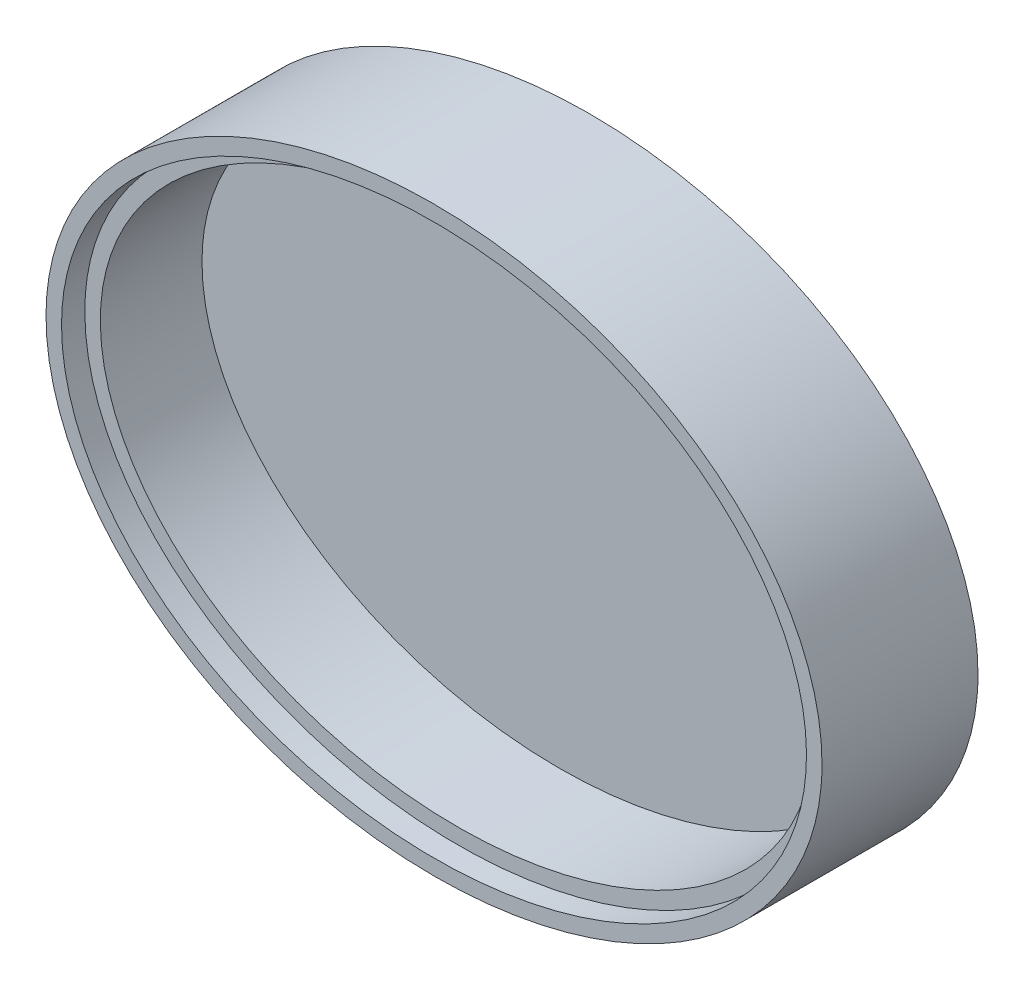
ISO-10303-21;
HEADER;
FILE_DESCRIPTION(('STEP AP214'),'2;1');
FILE_NAME('part.step','',(''),(''),'','','');
FILE_SCHEMA(('AUTOMOTIVE_DESIGN { 1 0 10303 214 1 1 1 1 }'));
ENDSEC;
DATA;
#1=APPLICATION_CONTEXT('core data for automotive mechanical design processes');
#2=APPLICATION_PROTOCOL_DEFINITION('international standard','automotive_design',2000,#1);
#3=PRODUCT_CONTEXT('',#1,'mechanical');
#4=PRODUCT('Part','Part','',(#3));
#5=PRODUCT_RELATED_PRODUCT_CATEGORY('part','',(#4));
#6=PRODUCT_DEFINITION_FORMATION('','',#4);
#7=PRODUCT_DEFINITION_CONTEXT('part definition',#1,'design');
#8=PRODUCT_DEFINITION('design','',#6,#7);
#9=PRODUCT_DEFINITION_SHAPE('','',#8);
#10=(LENGTH_UNIT() NAMED_UNIT(*) SI_UNIT(.MILLI.,.METRE.));
#11=(NAMED_UNIT(*) PLANE_ANGLE_UNIT() SI_UNIT($,.RADIAN.));
#12=(NAMED_UNIT(*) SI_UNIT($,.STERADIAN.) SOLID_ANGLE_UNIT());
#13=UNCERTAINTY_MEASURE_WITH_UNIT(LENGTH_MEASURE(1.E-05),#10,'distance_accuracy_value','');
#14=(GEOMETRIC_REPRESENTATION_CONTEXT(3) GLOBAL_UNCERTAINTY_ASSIGNED_CONTEXT((#13)) GLOBAL_UNIT_ASSIGNED_CONTEXT((#10,
#11,#12)) REPRESENTATION_CONTEXT('',''));
#15=CARTESIAN_POINT('',(0.,0.,0.));
#16=DIRECTION('',(0.,0.,1.));
#17=DIRECTION('',(1.,0.,0.));
#18=AXIS2_PLACEMENT_3D('',#15,#16,#17);
#19=CARTESIAN_POINT('',(0.,0.,20.1));
#20=DIRECTION('',(0.,0.,1.));
#21=DIRECTION('',(1.,0.,0.));
#22=AXIS2_PLACEMENT_3D('',#19,#20,#21);
#23=ELLIPSE('',#22,50.,37.5);
#24=DIRECTION('',(0.,0.,-1.));
#25=VECTOR('',#24,1.);
#26=SURFACE_OF_LINEAR_EXTRUSION('',#23,#25);
#27=CARTESIAN_POINT('',(50.,0.,20.1));
#28=VERTEX_POINT('',#27);
#29=EDGE_CURVE('E12',#28,#28,#23,.T.);
#30=ORIENTED_EDGE('',*,*,#29,.F.);
#31=EDGE_LOOP('',(#30));
#32=FACE_BOUND('',#31,.T.);
#33=CARTESIAN_POINT('',(0.,0.,0.));
#34=DIRECTION('',(0.,0.,1.));
#35=DIRECTION('',(1.,0.,0.));
#36=AXIS2_PLACEMENT_3D('',#33,#34,#35);
#37=ELLIPSE('',#36,50.,37.5);
#38=CARTESIAN_POINT('',(50.,0.,0.));
#39=VERTEX_POINT('',#38);
#40=EDGE_CURVE('E75',#39,#39,#37,.T.);
#41=ORIENTED_EDGE('',*,*,#40,.T.);
#42=EDGE_LOOP('',(#41));
#43=FACE_BOUND('',#42,.T.);
#44=ADVANCED_FACE('F61',(#32,#43),#26,.F.);
#45=CARTESIAN_POINT('',(0.,0.,20.1));
#46=DIRECTION('',(0.,0.,1.));
#47=DIRECTION('',(1.,0.,0.));
#48=AXIS2_PLACEMENT_3D('',#45,#46,#47);
#49=PLANE('',#48);
#50=CARTESIAN_POINT('',(0.,0.,20.1));
#51=DIRECTION('',(0.,0.,1.));
#52=DIRECTION('',(-1.,0.,0.));
#53=AXIS2_PLACEMENT_3D('',#50,#51,#52);
#54=ELLIPSE('',#53,48.,35.5);
#55=CARTESIAN_POINT('',(-48.,0.,20.1));
#56=VERTEX_POINT('',#55);
#57=EDGE_CURVE('E217',#56,#56,#54,.T.);
#58=ORIENTED_EDGE('',*,*,#57,.F.);
#59=EDGE_LOOP('',(#58));
#60=FACE_BOUND('',#59,.T.);
#61=ORIENTED_EDGE('',*,*,#29,.T.);
#62=EDGE_LOOP('',(#61));
#63=FACE_BOUND('',#62,.T.);
#64=ADVANCED_FACE('F106',(#60,#63),#49,.T.);
#65=CARTESIAN_POINT('',(0.,0.,0.));
#66=DIRECTION('',(0.,0.,1.));
#67=DIRECTION('',(1.,0.,0.));
#68=AXIS2_PLACEMENT_3D('',#65,#66,#67);
#69=PLANE('',#68);
#70=ORIENTED_EDGE('',*,*,#40,.F.);
#71=EDGE_LOOP('',(#70));
#72=FACE_BOUND('',#71,.T.);
#73=ADVANCED_FACE('F108',(#72),#69,.F.);
#74=CARTESIAN_POINT('',(0.,0.,17.1));
#75=DIRECTION('',(0.,0.,1.));
#76=DIRECTION('',(-1.,0.,0.));
#77=AXIS2_PLACEMENT_3D('',#74,#75,#76);
#78=ELLIPSE('',#77,48.,35.5);
#79=DIRECTION('',(0.,0.,1.));
#80=VECTOR('',#79,1.);
#81=SURFACE_OF_LINEAR_EXTRUSION('',#78,#80);
#82=CARTESIAN_POINT('',(-48.,0.,17.1));
#83=VERTEX_POINT('',#82);
#84=EDGE_CURVE('E212',#83,#83,#78,.T.);
#85=ORIENTED_EDGE('',*,*,#84,.F.);
#86=EDGE_LOOP('',(#85));
#87=FACE_BOUND('',#86,.T.);
#88=ORIENTED_EDGE('',*,*,#57,.T.);
#89=EDGE_LOOP('',(#88));
#90=FACE_BOUND('',#89,.T.);
#91=ADVANCED_FACE('F111',(#87,#90),#81,.F.);
#92=CARTESIAN_POINT('',(0.,0.,17.1));
#93=DIRECTION('',(0.,0.,1.));
#94=DIRECTION('',(1.,0.,0.));
#95=AXIS2_PLACEMENT_3D('',#92,#93,#94);
#96=PLANE('',#95);
#97=CARTESIAN_POINT('',(46.,0.,17.1));
#98=CARTESIAN_POINT('',(45.999990115339,0.720024415514175,17.1));
#99=CARTESIAN_POINT('',(45.9676969535407,1.44026365261996,17.1));
#100=CARTESIAN_POINT('',(45.8391276929752,2.87518913099918,17.1));
#101=CARTESIAN_POINT('',(45.7428234579524,3.58987279048201,17.1));
#102=CARTESIAN_POINT('',(45.4879122244435,5.00918065721287,17.1));
#103=CARTESIAN_POINT('',(45.3292081554156,5.71378741014139,17.1));
#104=CARTESIAN_POINT('',(44.9524690364869,7.10680925465893,17.1));
#105=CARTESIAN_POINT('',(44.7344400755839,7.79522600008666,17.1));
#106=CARTESIAN_POINT('',(44.24417204866,9.14794686513593,17.1));
#107=CARTESIAN_POINT('',(43.9722503818986,9.81236643773387,17.1));
#108=CARTESIAN_POINT('',(43.3775260535112,11.1179950674307,17.1));
#109=CARTESIAN_POINT('',(43.0547204716707,11.759202789809,17.1));
#110=CARTESIAN_POINT('',(42.3627558135586,13.0155297598765,17.1));
#111=CARTESIAN_POINT('',(41.993624657623,13.6306644254982,17.1));
#112=CARTESIAN_POINT('',(41.2132328496304,14.8333827189064,17.1));
#113=CARTESIAN_POINT('',(40.8019765824852,15.4209692049913,17.1));
#114=CARTESIAN_POINT('',(39.7631742044163,16.8049704902302,17.1));
#115=CARTESIAN_POINT('',(39.1165678192279,17.5871390855512,17.1));
#116=CARTESIAN_POINT('',(37.758375164116,19.0921456655243,17.1));
#117=CARTESIAN_POINT('',(37.0468018178889,19.8149953962224,17.1));
#118=CARTESIAN_POINT('',(35.5618162655722,21.2071484106292,17.1));
#119=CARTESIAN_POINT('',(34.7879284224296,21.8759424456422,17.1));
#120=CARTESIAN_POINT('',(33.1920420831159,23.1536360677172,17.1));
#121=CARTESIAN_POINT('',(32.3700348619913,23.7625247388162,17.1));
#122=CARTESIAN_POINT('',(31.1061644231233,24.6318370649833,17.1));
#123=CARTESIAN_POINT('',(30.6793839062989,24.9144755573382,17.1));
#124=CARTESIAN_POINT('',(29.8165722586804,25.4650187860401,17.1));
#125=CARTESIAN_POINT('',(29.3805435495056,25.7329273149751,17.1));
#126=CARTESIAN_POINT('',(28.0597462818835,26.5148005304729,17.1));
#127=CARTESIAN_POINT('',(27.1620454956099,27.0070641886344,17.1));
#128=CARTESIAN_POINT('',(25.1792208529042,28.0155690898059,17.1));
#129=CARTESIAN_POINT('',(24.0886549072573,28.521089582153,17.1));
#130=CARTESIAN_POINT('',(21.8766482680563,29.4555674732487,17.1));
#131=CARTESIAN_POINT('',(20.7552387468291,29.8845991154026,17.1));
#132=CARTESIAN_POINT('',(18.0723430835572,30.8119444379895,17.1));
#133=CARTESIAN_POINT('',(16.4997431705678,31.2783146298995,17.1));
#134=CARTESIAN_POINT('',(13.3202873972492,32.077319158505,17.1));
#135=CARTESIAN_POINT('',(11.7134119426401,32.4098747159201,17.1));
#136=CARTESIAN_POINT('',(8.47945428101142,32.9436877097692,17.1));
#137=CARTESIAN_POINT('',(6.85239010818363,33.1450547835589,17.1));
#138=CARTESIAN_POINT('',(3.58777179406265,33.4187295086884,17.1));
#139=CARTESIAN_POINT('',(1.95021937804701,33.4910578656458,17.1));
#140=CARTESIAN_POINT('',(-1.32547723173237,33.5073850578491,17.1));
#141=CARTESIAN_POINT('',(-2.9636214080981,33.4513874005873,17.1));
#142=CARTESIAN_POINT('',(-6.23055820978415,33.2105468886148,17.1));
#143=CARTESIAN_POINT('',(-7.8593503214109,33.0256970232507,17.1));
#144=CARTESIAN_POINT('',(-11.0794540520963,32.5281563248961,17.1));
#145=CARTESIAN_POINT('',(-12.670980330065,32.2168595978729,17.1));
#146=CARTESIAN_POINT('',(-15.8229563316285,31.4637865431486,17.1));
#147=CARTESIAN_POINT('',(-17.3834087754245,31.0220216906919,17.1));
#148=CARTESIAN_POINT('',(-20.2844188646607,30.0623613211243,17.1));
#149=CARTESIAN_POINT('',(-21.6297529069752,29.5589014421907,17.1));
#150=CARTESIAN_POINT('',(-24.2747020131478,28.4434395898801,17.1));
#151=CARTESIAN_POINT('',(-25.5743257218669,27.8314582740835,17.1));
#152=CARTESIAN_POINT('',(-27.9399890424851,26.5873386199161,17.1));
#153=CARTESIAN_POINT('',(-29.0135731467934,25.9695456596651,17.1));
#154=CARTESIAN_POINT('',(-31.1068845080929,24.6482513049911,17.1));
#155=CARTESIAN_POINT('',(-32.1266165949294,23.9447576156181,17.1));
#156=CARTESIAN_POINT('',(-33.9573011563569,22.5582108189922,17.1));
#157=CARTESIAN_POINT('',(-34.7771332924504,21.8868862134155,17.1));
#158=CARTESIAN_POINT('',(-36.3589682952707,20.4797176851427,17.1));
#159=CARTESIAN_POINT('',(-37.1210012521521,19.7439077694653,17.1));
#160=CARTESIAN_POINT('',(-38.4770823317484,18.3131915292161,17.1));
#161=CARTESIAN_POINT('',(-39.0798252208424,17.6265566682081,17.1));
#162=CARTESIAN_POINT('',(-39.9404729102131,16.5610265435434,17.1));
#163=CARTESIAN_POINT('',(-40.2202713089135,16.199684652988,17.1));
#164=CARTESIAN_POINT('',(-40.7643062722167,15.465349367683,17.1));
#165=CARTESIAN_POINT('',(-41.0285394819073,15.0923534873606,17.1));
#166=CARTESIAN_POINT('',(-41.7418501665301,14.0368179977532,17.1));
#167=CARTESIAN_POINT('',(-42.1726715930206,13.3417744019237,17.1));
#168=CARTESIAN_POINT('',(-42.9746995369692,11.917881845297,17.1));
#169=CARTESIAN_POINT('',(-43.3458917538005,11.1890248290213,17.1));
#170=CARTESIAN_POINT('',(-44.0222796571298,9.70091048902919,17.1));
#171=CARTESIAN_POINT('',(-44.3274683159366,8.94164993830386,17.1));
#172=CARTESIAN_POINT('',(-44.7310606591149,7.78412012124577,17.1));
#173=CARTESIAN_POINT('',(-44.8565693751974,7.39513104973345,17.1));
#174=CARTESIAN_POINT('',(-45.0888843448192,6.61162062533261,17.1));
#175=CARTESIAN_POINT('',(-45.1956923777981,6.21709980267348,17.1));
#176=CARTESIAN_POINT('',(-45.4170849194538,5.31263153988426,17.1));
#177=CARTESIAN_POINT('',(-45.5255350535559,4.80116970255663,17.1));
#178=CARTESIAN_POINT('',(-45.7097739395517,3.77238486490653,17.1));
#179=CARTESIAN_POINT('',(-45.7855618764405,3.25506171866001,17.1));
#180=CARTESIAN_POINT('',(-45.9036972269667,2.21660740863111,17.1));
#181=CARTESIAN_POINT('',(-45.9460451686752,1.69547630511362,17.1));
#182=CARTESIAN_POINT('',(-45.9968386432803,0.651886836175442,17.1));
#183=CARTESIAN_POINT('',(-46.0053051288865,0.12942949103661,17.1));
#184=CARTESIAN_POINT('',(-45.9883004982608,-0.914946483863848,17.1));
#185=CARTESIAN_POINT('',(-45.9628288377081,-1.43686510485073,17.1));
#186=CARTESIAN_POINT('',(-45.8782335776505,-2.4778630906691,17.1));
#187=CARTESIAN_POINT('',(-45.8191147538411,-2.9969428478797,17.1));
#188=CARTESIAN_POINT('',(-45.644266813479,-4.19113559699108,17.1));
#189=CARTESIAN_POINT('',(-45.5166461208896,-4.86453696067709,17.1));
#190=CARTESIAN_POINT('',(-45.206768714853,-6.19848402099751,17.1));
#191=CARTESIAN_POINT('',(-45.024517637475,-6.85903103629772,17.1));
#192=CARTESIAN_POINT('',(-44.6082441819838,-8.16372053899362,17.1));
#193=CARTESIAN_POINT('',(-44.3742107201653,-8.80785948137548,17.1));
#194=CARTESIAN_POINT('',(-43.8577990691227,-10.0764254471221,17.1));
#195=CARTESIAN_POINT('',(-43.575418170711,-10.7008513635278,17.1));
#196=CARTESIAN_POINT('',(-42.947084963491,-11.9655270068485,17.1));
#197=CARTESIAN_POINT('',(-42.5982756324822,-12.6043552133538,17.1));
#198=CARTESIAN_POINT('',(-41.8547875096157,-13.8546970850282,17.1));
#199=CARTESIAN_POINT('',(-41.4601057628685,-14.4662089870907,17.1));
#200=CARTESIAN_POINT('',(-40.6294047889637,-15.6602158787531,17.1));
#201=CARTESIAN_POINT('',(-40.1933937006159,-16.2427165470884,17.1));
#202=CARTESIAN_POINT('',(-39.2840700625004,-17.3779835703174,17.1));
#203=CARTESIAN_POINT('',(-38.8107497341165,-17.9307436839579,17.1));
#204=CARTESIAN_POINT('',(-37.947929819273,-18.8773706691614,17.1));
#205=CARTESIAN_POINT('',(-37.5654226594271,-19.2776469090383,17.1));
#206=CARTESIAN_POINT('',(-36.7827993300297,-20.0604221063859,17.1));
#207=CARTESIAN_POINT('',(-36.3826860253512,-20.4429239354357,17.1));
#208=CARTESIAN_POINT('',(-35.1585260127391,-21.5634312594158,17.1));
#209=CARTESIAN_POINT('',(-34.3101061715451,-22.2750405442364,17.1));
#210=CARTESIAN_POINT('',(-32.5604297020443,-23.6272055273565,17.1));
#211=CARTESIAN_POINT('',(-31.6592363566754,-24.2678437670444,17.1));
#212=CARTESIAN_POINT('',(-29.8117369786443,-25.4806164576257,17.1));
#213=CARTESIAN_POINT('',(-28.8654198587274,-26.0527339499204,17.1));
#214=CARTESIAN_POINT('',(-26.6178349735788,-27.3071565839778,17.1));
#215=CARTESIAN_POINT('',(-25.3022065108578,-27.9637990734609,17.1));
#216=CARTESIAN_POINT('',(-22.6197748273085,-29.1625198384624,17.1));
#217=CARTESIAN_POINT('',(-21.2529589080867,-29.7045694616108,17.1));
#218=CARTESIAN_POINT('',(-18.4820633388183,-30.6770084021456,17.1));
#219=CARTESIAN_POINT('',(-17.0780277542263,-31.1075237840213,17.1));
#220=CARTESIAN_POINT('',(-14.2415657035517,-31.8606486256633,17.1));
#221=CARTESIAN_POINT('',(-12.8091414893749,-32.1832666083042,17.1));
#222=CARTESIAN_POINT('',(-9.92530374165991,-32.7228363015313,17.1));
#223=CARTESIAN_POINT('',(-8.47389939559561,-32.939837324531,17.1));
#224=CARTESIAN_POINT('',(-5.55935053862219,-33.2699766459477,17.1));
#225=CARTESIAN_POINT('',(-4.09620583217974,-33.3831132108862,17.1));
#226=CARTESIAN_POINT('',(-1.16580563270898,-33.506337194503,17.1));
#227=CARTESIAN_POINT('',(0.301449258550584,-33.5164389827077,17.1));
#228=CARTESIAN_POINT('',(3.23305308127978,-33.4337049702699,17.1));
#229=CARTESIAN_POINT('',(4.69740203818764,-33.3408700747414,17.1));
#230=CARTESIAN_POINT('',(7.61612094288179,-33.0515601161527,17.1));
#231=CARTESIAN_POINT('',(9.07048913977001,-32.8550673168434,17.1));
#232=CARTESIAN_POINT('',(11.961236493436,-32.3569919008615,17.1));
#233=CARTESIAN_POINT('',(13.3976151972871,-32.0554066437339,17.1));
#234=CARTESIAN_POINT('',(16.2445347206341,-31.3447784967655,17.1));
#235=CARTESIAN_POINT('',(17.6550600770853,-30.9356734068076,17.1));
#236=CARTESIAN_POINT('',(20.4394734624621,-30.0072227528074,17.1));
#237=CARTESIAN_POINT('',(21.8133639752503,-29.487884684124,17.1));
#238=CARTESIAN_POINT('',(24.3946532740993,-28.3859583988257,17.1));
#239=CARTESIAN_POINT('',(25.6061040522932,-27.8128748800683,17.1));
#240=CARTESIAN_POINT('',(27.9780971296663,-26.5690871496972,17.1));
#241=CARTESIAN_POINT('',(29.138642231669,-25.8983883215023,17.1));
#242=CARTESIAN_POINT('',(31.2294159728165,-24.562819733653,17.1));
#243=CARTESIAN_POINT('',(32.1683906551255,-23.9116417883005,17.1));
#244=CARTESIAN_POINT('',(33.9897114430654,-22.5350848996556,17.1));
#245=CARTESIAN_POINT('',(34.8720935710529,-21.8097539346671,17.1));
#246=CARTESIAN_POINT('',(36.4485339966777,-20.3924031405022,17.1));
#247=CARTESIAN_POINT('',(37.1515261952683,-19.7103222132642,17.1));
#248=CARTESIAN_POINT('',(38.5006201859011,-18.2896931601504,17.1));
#249=CARTESIAN_POINT('',(39.1466309833765,-17.5510581136757,17.1));
#250=CARTESIAN_POINT('',(40.3003152043383,-16.1078673401824,17.1));
#251=CARTESIAN_POINT('',(40.8153506318164,-15.4092039191089,17.1));
#252=CARTESIAN_POINT('',(41.7854430014883,-13.9708845505371,17.1));
#253=CARTESIAN_POINT('',(42.2404771539251,-13.2312131779985,17.1));
#254=CARTESIAN_POINT('',(43.0819886013713,-11.7153354856601,17.1));
#255=CARTESIAN_POINT('',(43.4685931624879,-10.9392004584966,17.1));
#256=CARTESIAN_POINT('',(43.9919181393195,-9.75063721855407,17.1));
#257=CARTESIAN_POINT('',(44.1569034161954,-9.35046798727479,17.1));
#258=CARTESIAN_POINT('',(44.4672045567344,-8.54259789689242,17.1));
#259=CARTESIAN_POINT('',(44.6125236868167,-8.13489830134983,17.1));
#260=CARTESIAN_POINT('',(44.8485414517685,-7.41656922862468,17.1));
#261=CARTESIAN_POINT('',(44.9437674094153,-7.10741917112181,17.1));
#262=CARTESIAN_POINT('',(45.1224176278797,-6.48579612190264,17.1));
#263=CARTESIAN_POINT('',(45.2058440086753,-6.17332373796844,17.1));
#264=CARTESIAN_POINT('',(45.437889106707,-5.23183417155692,17.1));
#265=CARTESIAN_POINT('',(45.5684334113312,-4.59826045786406,17.1));
#266=CARTESIAN_POINT('',(45.7819034537495,-3.30653253413109,17.1));
#267=CARTESIAN_POINT('',(45.8635340763903,-2.64816292997793,17.1));
#268=CARTESIAN_POINT('',(45.9453279659479,-1.65716764627293,17.1));
#269=CARTESIAN_POINT('',(45.9658173106521,-1.32611779791166,17.1));
#270=CARTESIAN_POINT('',(45.9931569741325,-0.663393906325981,17.1));
#271=CARTESIAN_POINT('',(46.0000045539252,-0.331719751131501,17.1));
#272=CARTESIAN_POINT('',(46.,0.,17.1));
#273=B_SPLINE_CURVE_WITH_KNOTS('',3,(#97,#98,#99,#100,#101,#102,#103,#104,#105,#106,#107,#108,
#109,#110,#111,#112,#113,#114,#115,#116,#117,#118,#119,#120,#121,#122,#123,#124,#125,#126,#127,
#128,#129,#130,#131,#132,#133,#134,#135,#136,#137,#138,#139,#140,#141,#142,#143,#144,#145,#146,
#147,#148,#149,#150,#151,#152,#153,#154,#155,#156,#157,#158,#159,#160,#161,#162,#163,#164,#165,
#166,#167,#168,#169,#170,#171,#172,#173,#174,#175,#176,#177,#178,#179,#180,#181,#182,#183,#184,
#185,#186,#187,#188,#189,#190,#191,#192,#193,#194,#195,#196,#197,#198,#199,#200,#201,#202,#203,
#204,#205,#206,#207,#208,#209,#210,#211,#212,#213,#214,#215,#216,#217,#218,#219,#220,#221,#222,
#223,#224,#225,#226,#227,#228,#229,#230,#231,#232,#233,#234,#235,#236,#237,#238,#239,#240,#241,
#242,#243,#244,#245,#246,#247,#248,#249,#250,#251,#252,#253,#254,#255,#256,#257,#258,#259,#260,
#261,#262,#263,#264,#265,#266,#267,#268,#269,#270,#271,#272),.UNSPECIFIED.,.T.,.F.,(4,2,2,2,2,2,
2,2,2,2,2,2,2,2,2,2,2,2,2,2,2,2,2,2,2,2,2,2,2,2,2,2,2,2,2,2,2,2,2,2,2,2,2,2,2,2,2,2,2,2,2,2,2,2,
2,2,2,2,2,2,2,2,2,2,2,2,2,2,2,2,2,2,2,2,2,2,2,2,2,2,2,2,2,2,2,2,2,4),(0.,2.1597288923423,
4.32040772821799,6.48446114690481,8.64829253485918,10.7997397897789,12.9513105606744,
15.1015907560129,17.2516473501465,20.2917588640528,23.331266929267,26.3966974907636,
29.4626856048476,30.9980916581475,32.5331005144107,35.6023161000945,39.2053475681941,
42.8048625074875,47.7192873307651,52.6366011534083,57.5498001695428,62.4622107403564,
67.374487043493,72.2870306370047,77.1468220102746,82.0061860707926,86.3111550072651,
90.6153053500319,94.3275547271761,98.0394705950603,101.215155882077,104.389176400744,
107.127077877736,108.497732577858,109.868681635211,112.318986503946,114.769878144677,
117.221030614369,118.446848771095,119.672550223204,121.239984990301,122.80745886662,
124.374907989523,125.941387632653,127.50789240024,129.074174882078,131.12787193892,
133.181357194265,135.235282411609,137.289322760005,139.470790382399,141.652398602838,
143.833578097548,146.015213556095,147.675605858084,149.335728972892,152.65353150994,
155.967433912753,159.282154805073,163.687267221583,168.093479776561,172.494690150142,
176.895552787551,181.294358692404,185.693238011173,190.091503841184,194.489730997903,
198.88871095169,203.287801438107,207.689442417184,212.090784199807,216.107176279325,
220.123346941384,223.547975687531,226.970402496271,229.905983284842,232.846170144723,
235.447306621518,238.049428236656,240.646658350208,241.944778407094,243.242682589352,
244.212910970328,245.182964812615,247.121547307386,249.109419164452,250.104220056447,
251.099220663707),.UNSPECIFIED.);
#274=CARTESIAN_POINT('',(46.,0.,17.1));
#275=VERTEX_POINT('',#274);
#276=EDGE_CURVE('E64',#275,#275,#273,.T.);
#277=ORIENTED_EDGE('',*,*,#276,.F.);
#278=EDGE_LOOP('',(#277));
#279=FACE_BOUND('',#278,.T.);
#280=ORIENTED_EDGE('',*,*,#84,.T.);
#281=EDGE_LOOP('',(#280));
#282=FACE_BOUND('',#281,.T.);
#283=ADVANCED_FACE('F104',(#279,#282),#96,.T.);
#284=CARTESIAN_POINT('',(0.,0.,4.));
#285=DIRECTION('',(0.,0.,1.));
#286=DIRECTION('',(1.,0.,0.));
#287=AXIS2_PLACEMENT_3D('',#284,#285,#286);
#288=PLANE('',#287);
#289=CARTESIAN_POINT('',(-46.,0.,4.));
#290=CARTESIAN_POINT('',(-46.0000006467883,-0.479954722660342,4.));
#291=CARTESIAN_POINT('',(-45.9856670328346,-0.959899282770047,4.));
#292=CARTESIAN_POINT('',(-45.9284478329094,-1.91834687574689,4.));
#293=CARTESIAN_POINT('',(-45.8855467720532,-2.39684898604587,4.));
#294=CARTESIAN_POINT('',(-45.7715516631447,-3.35052953986645,4.));
#295=CARTESIAN_POINT('',(-45.700454498937,-3.82570761011545,4.));
#296=CARTESIAN_POINT('',(-45.5305296787989,-4.7719622918162,4.));
#297=CARTESIAN_POINT('',(-45.431651797274,-5.24302986641563,4.));
#298=CARTESIAN_POINT('',(-45.207054312938,-6.17866063370336,4.));
#299=CARTESIAN_POINT('',(-45.0813377682988,-6.64322456103833,4.));
#300=CARTESIAN_POINT('',(-44.804074172818,-7.56451641508421,4.));
#301=CARTESIAN_POINT('',(-44.6525283607939,-8.02124471644987,4.));
#302=CARTESIAN_POINT('',(-44.2442558395394,-9.14769723581948,4.));
#303=CARTESIAN_POINT('',(-43.9724024143176,-9.8119895819827,4.));
#304=CARTESIAN_POINT('',(-43.37787129037,-11.1172802195231,4.));
#305=CARTESIAN_POINT('',(-43.0551936053094,-11.7582785171633,4.));
#306=CARTESIAN_POINT('',(-42.3633598822285,-13.0144981474507,4.));
#307=CARTESIAN_POINT('',(-41.9942102309263,-13.6297230067284,4.));
#308=CARTESIAN_POINT('',(-41.2135981912669,-14.8328585766816,4.));
#309=CARTESIAN_POINT('',(-40.802126516464,-15.4207632514058,4.));
#310=CARTESIAN_POINT('',(-40.0634089334466,-16.40497078764,4.));
#311=CARTESIAN_POINT('',(-39.7454255692537,-16.8082752826699,4.));
#312=CARTESIAN_POINT('',(-39.0914505330545,-17.5998435174175,4.));
#313=CARTESIAN_POINT('',(-38.755462375185,-17.9881101668874,4.));
#314=CARTESIAN_POINT('',(-37.7221939627186,-19.1304740267664,4.));
#315=CARTESIAN_POINT('',(-36.9997220431923,-19.8619867376826,4.));
#316=CARTESIAN_POINT('',(-35.496711061608,-21.2650907526631,4.));
#317=CARTESIAN_POINT('',(-34.716068308825,-21.9365701232031,4.));
#318=CARTESIAN_POINT('',(-33.1065033557533,-23.2187056136901,4.));
#319=CARTESIAN_POINT('',(-32.277580180043,-23.8293605041085,4.));
#320=CARTESIAN_POINT('',(-30.2851833813543,-25.1916817150326,4.));
#321=CARTESIAN_POINT('',(-29.1051090644375,-25.9191289850137,4.));
#322=CARTESIAN_POINT('',(-26.6861997819331,-27.2688296417489,4.));
#323=CARTESIAN_POINT('',(-25.447344903225,-27.8910470491673,4.));
#324=CARTESIAN_POINT('',(-22.9230639460643,-29.0335959767781,4.));
#325=CARTESIAN_POINT('',(-21.6376186110286,-29.553884785832,4.));
#326=CARTESIAN_POINT('',(-19.031186389475,-30.4952206744786,4.));
#327=CARTESIAN_POINT('',(-17.7102025221879,-30.916276155114,4.));
#328=CARTESIAN_POINT('',(-15.0104281654146,-31.6704523555623,4.));
#329=CARTESIAN_POINT('',(-13.6310074536017,-32.0013099508537,4.));
#330=CARTESIAN_POINT('',(-10.8522096228388,-32.564126100929,4.));
#331=CARTESIAN_POINT('',(-9.45283223770196,-32.7960833352796,4.));
#332=CARTESIAN_POINT('',(-6.64097956604895,-33.1627242739075,4.));
#333=CARTESIAN_POINT('',(-5.22850031836199,-33.2973775198188,4.));
#334=CARTESIAN_POINT('',(-2.39762218949036,-33.4702164199296,4.));
#335=CARTESIAN_POINT('',(-0.979222876451217,-33.5083949088302,4.));
#336=CARTESIAN_POINT('',(2.15028936003574,-33.4864771782414,4.));
#337=CARTESIAN_POINT('',(3.86129380899522,-33.4044319687027,4.));
#338=CARTESIAN_POINT('',(7.27107557032004,-33.0993727492565,4.));
#339=CARTESIAN_POINT('',(8.96985010674585,-32.8763276959086,4.));
#340=CARTESIAN_POINT('',(12.3422823537543,-32.2870775517606,4.));
#341=CARTESIAN_POINT('',(14.0159432464359,-31.92089075996,4.));
#342=CARTESIAN_POINT('',(17.3240751003877,-31.0418565115656,4.));
#343=CARTESIAN_POINT('',(18.9585599300019,-30.5290618108251,4.));
#344=CARTESIAN_POINT('',(21.7522482766307,-29.5058391536143,4.));
#345=CARTESIAN_POINT('',(22.9241059114146,-29.0297617523372,4.));
#346=CARTESIAN_POINT('',(25.2297665879853,-27.9925881181143,4.));
#347=CARTESIAN_POINT('',(26.3635710470392,-27.4314950558264,4.));
#348=CARTESIAN_POINT('',(28.5822518252217,-26.222641278824,4.));
#349=CARTESIAN_POINT('',(29.6671894238191,-25.5749933928257,4.));
#350=CARTESIAN_POINT('',(31.7783454069747,-24.19015941181,4.));
#351=CARTESIAN_POINT('',(32.8045801365464,-23.452998420774,4.));
#352=CARTESIAN_POINT('',(34.5365063567779,-22.0836524523326,4.));
#353=CARTESIAN_POINT('',(35.2580574751499,-21.4714825637193,4.));
#354=CARTESIAN_POINT('',(36.6539831527152,-20.1954210243311,4.));
#355=CARTESIAN_POINT('',(37.328360483416,-19.531532416935,4.));
#356=CARTESIAN_POINT('',(38.6218135883349,-18.1527294525183,4.));
#357=CARTESIAN_POINT('',(39.2409410555091,-17.4378639417831,4.));
#358=CARTESIAN_POINT('',(40.1219757694334,-16.3281181594538,4.));
#359=CARTESIAN_POINT('',(40.4077004052802,-15.951978010771,4.));
#360=CARTESIAN_POINT('',(40.9622746242972,-15.1872894320709,4.));
#361=CARTESIAN_POINT('',(41.2311198321301,-14.7987378239214,4.));
#362=CARTESIAN_POINT('',(41.9091146861096,-13.7689967231517,4.));
#363=CARTESIAN_POINT('',(42.3038535913633,-13.1182299869485,4.));
#364=CARTESIAN_POINT('',(43.0410956952496,-11.7877831147967,4.));
#365=CARTESIAN_POINT('',(43.3836104623867,-11.1081094250015,4.));
#366=CARTESIAN_POINT('',(43.8543043721789,-10.0693698278628,4.));
#367=CARTESIAN_POINT('',(44.0040146452949,-9.71994083288601,4.));
#368=CARTESIAN_POINT('',(44.2884958845029,-9.01508732620347,4.));
#369=CARTESIAN_POINT('',(44.4232690894518,-8.6596637222319,4.));
#370=CARTESIAN_POINT('',(44.6773110680713,-7.94326678862281,4.));
#371=CARTESIAN_POINT('',(44.796577953153,-7.58229278895205,4.));
#372=CARTESIAN_POINT('',(45.0190311273851,-6.85544059320674,4.));
#373=CARTESIAN_POINT('',(45.1222179301694,-6.48956255418377,4.));
#374=CARTESIAN_POINT('',(45.3444691905823,-5.62763162652055,4.));
#375=CARTESIAN_POINT('',(45.4568966487132,-5.12984914359858,4.));
#376=CARTESIAN_POINT('',(45.6508370949206,-4.12828675105697,4.));
#377=CARTESIAN_POINT('',(45.7323490609178,-3.62450664372109,4.));
#378=CARTESIAN_POINT('',(45.8636685159559,-2.61282380250241,4.));
#379=CARTESIAN_POINT('',(45.9134763843941,-2.10492111802741,4.));
#380=CARTESIAN_POINT('',(45.9808793186991,-1.08713236653408,4.));
#381=CARTESIAN_POINT('',(45.9984839091249,-0.577246930666846,4.));
#382=CARTESIAN_POINT('',(46.0013282986449,0.442629204218435,4.));
#383=CARTESIAN_POINT('',(45.9865676033683,0.952619904725396,4.));
#384=CARTESIAN_POINT('',(45.924843602241,1.97055865756686,4.));
#385=CARTESIAN_POINT('',(45.8778841124167,2.4785069447824,4.));
#386=CARTESIAN_POINT('',(45.7305390224347,3.66498572408202,4.));
#387=CARTESIAN_POINT('',(45.617316521453,4.34195770035869,4.));
#388=CARTESIAN_POINT('',(45.3354276128963,5.68410652500522,4.));
#389=CARTESIAN_POINT('',(45.1667658397545,6.34928435440713,4.));
#390=CARTESIAN_POINT('',(44.7767419268955,7.66402857628477,4.));
#391=CARTESIAN_POINT('',(44.5553753657601,8.31359365396679,4.));
#392=CARTESIAN_POINT('',(44.0632600595417,9.59371367782331,4.));
#393=CARTESIAN_POINT('',(43.7925082794237,10.2242674528558,4.));
#394=CARTESIAN_POINT('',(43.1901736856842,11.4955209982419,4.));
#395=CARTESIAN_POINT('',(42.8561794475745,12.1350763339121,4.));
#396=CARTESIAN_POINT('',(42.1420425709227,13.3877858210128,4.));
#397=CARTESIAN_POINT('',(41.7618998596372,14.0009399308252,4.));
#398=CARTESIAN_POINT('',(40.9596581829326,15.1994183152115,4.));
#399=CARTESIAN_POINT('',(40.5375440240907,15.7847323976745,4.));
#400=CARTESIAN_POINT('',(39.6556300604989,16.9262365233453,4.));
#401=CARTESIAN_POINT('',(39.1958250557185,17.4824225304816,4.));
#402=CARTESIAN_POINT('',(37.9900748831008,18.8515552461109,4.));
#403=CARTESIAN_POINT('',(37.2214579769362,19.6446447929711,4.));
#404=CARTESIAN_POINT('',(35.6176966649882,21.1605148538224,4.));
#405=CARTESIAN_POINT('',(34.7825256433741,21.8832669797351,4.));
#406=CARTESIAN_POINT('',(33.0548853444793,23.2601853653095,4.));
#407=CARTESIAN_POINT('',(32.1623055875745,23.9142125900776,4.));
#408=CARTESIAN_POINT('',(30.3306890750426,25.153201433373,4.));
#409=CARTESIAN_POINT('',(29.3916522430323,25.7381629383394,4.));
#410=CARTESIAN_POINT('',(27.1522566996903,27.0262199559205,4.));
#411=CARTESIAN_POINT('',(25.8366269743351,27.7028467904315,4.));
#412=CARTESIAN_POINT('',(23.1516550461462,28.9396646466497,4.));
#413=CARTESIAN_POINT('',(21.7822951876029,29.4998170074721,4.));
#414=CARTESIAN_POINT('',(19.0025374935676,30.5073098181224,4.));
#415=CARTESIAN_POINT('',(17.5921315534351,30.9546278176604,4.));
#416=CARTESIAN_POINT('',(14.7413625830965,31.7393962776423,4.));
#417=CARTESIAN_POINT('',(13.301002082183,32.076855974512,4.));
#418=CARTESIAN_POINT('',(10.370828975238,32.6500007908442,4.));
#419=CARTESIAN_POINT('',(8.88060084413833,32.8835548848862,4.));
#420=CARTESIAN_POINT('',(5.88708475760743,33.2408367664273,4.));
#421=CARTESIAN_POINT('',(4.38379658686,33.3645627397469,4.));
#422=CARTESIAN_POINT('',(1.37104722615632,33.5031891704286,4.));
#423=CARTESIAN_POINT('',(-0.138417810374743,33.5180061918781,4.));
#424=CARTESIAN_POINT('',(-3.15447722719182,33.438722879971,4.));
#425=CARTESIAN_POINT('',(-4.66107143583649,33.3446162270174,4.));
#426=CARTESIAN_POINT('',(-7.90106220519258,33.0231476098295,4.));
#427=CARTESIAN_POINT('',(-9.63267924696288,32.7770790598952,4.));
#428=CARTESIAN_POINT('',(-12.2089430960526,32.2958146618101,4.));
#429=CARTESIAN_POINT('',(-13.0643804908117,32.116641185198,4.));
#430=CARTESIAN_POINT('',(-14.7664276162725,31.7204076050521,4.));
#431=CARTESIAN_POINT('',(-15.6130370881868,31.5033463941428,4.));
#432=CARTESIAN_POINT('',(-18.134865484381,30.7950068176815,4.));
#433=CARTESIAN_POINT('',(-19.794565765361,30.2461140910871,4.));
#434=CARTESIAN_POINT('',(-22.2371882124101,29.3042247663408,4.));
#435=CARTESIAN_POINT('',(-23.0434872351217,28.9705470182677,4.));
#436=CARTESIAN_POINT('',(-24.6381515471191,28.2628067518592,4.));
#437=CARTESIAN_POINT('',(-25.4265185159696,27.8887480347289,4.));
#438=CARTESIAN_POINT('',(-27.2011850588314,26.9884223801414,4.));
#439=CARTESIAN_POINT('',(-28.180846997746,26.448922510424,4.));
#440=CARTESIAN_POINT('',(-29.6189619077094,25.5878774495162,4.));
#441=CARTESIAN_POINT('',(-30.0930813024258,25.2922457199394,4.));
#442=CARTESIAN_POINT('',(-31.0301045106915,24.6833604156357,4.));
#443=CARTESIAN_POINT('',(-31.4930043127499,24.3701006673201,4.));
#444=CARTESIAN_POINT('',(-32.8616680575501,23.4046714092755,4.));
#445=CARTESIAN_POINT('',(-33.7489452279402,22.7259298425243,4.));
#446=CARTESIAN_POINT('',(-35.463572202159,21.2968395032474,4.));
#447=CARTESIAN_POINT('',(-36.290941868527,20.5465146573986,4.));
#448=CARTESIAN_POINT('',(-37.698330840876,19.1487003882851,4.));
#449=CARTESIAN_POINT('',(-38.2924610129466,18.5154081239656,4.));
#450=CARTESIAN_POINT('',(-39.4313018775729,17.2057662008476,4.));
#451=CARTESIAN_POINT('',(-39.9760153383716,16.5294189575347,4.));
#452=CARTESIAN_POINT('',(-41.0089637625045,15.1350730918547,4.));
#453=CARTESIAN_POINT('',(-41.4972246264305,14.4170937992312,4.));
#454=CARTESIAN_POINT('',(-42.1816749177998,13.3108091607983,4.));
#455=CARTESIAN_POINT('',(-42.4018264636054,12.9371782580033,4.));
#456=CARTESIAN_POINT('',(-42.8253279975764,12.1803679829122,4.));
#457=CARTESIAN_POINT('',(-43.028673493164,11.797186092857,4.));
#458=CARTESIAN_POINT('',(-43.5470355191636,10.7636440965177,4.));
#459=CARTESIAN_POINT('',(-43.8462532087559,10.1052702272442,4.));
#460=CARTESIAN_POINT('',(-44.3907981564727,8.76662578734994,4.));
#461=CARTESIAN_POINT('',(-44.6361357809115,8.08635945768039,4.));
#462=CARTESIAN_POINT('',(-44.9605353559256,7.05318094797723,4.));
#463=CARTESIAN_POINT('',(-45.0613296354718,6.70697532222372,4.));
#464=CARTESIAN_POINT('',(-45.2480866696697,6.01062600308548,4.));
#465=CARTESIAN_POINT('',(-45.3340519668586,5.66048299578167,4.));
#466=CARTESIAN_POINT('',(-45.4907392425152,4.95694305217122,4.));
#467=CARTESIAN_POINT('',(-45.5614670717272,4.60354741932203,4.));
#468=CARTESIAN_POINT('',(-45.6873901150463,3.89401205741464,4.));
#469=CARTESIAN_POINT('',(-45.7425854831083,3.53787235559108,4.));
#470=CARTESIAN_POINT('',(-45.8596528650575,2.65368801185549,4.));
#471=CARTESIAN_POINT('',(-45.9122316643984,2.12438316564948,4.));
#472=CARTESIAN_POINT('',(-45.9824078756449,1.06338165242968,4.));
#473=CARTESIAN_POINT('',(-45.9999992835004,0.531684590584874,4.));
#474=CARTESIAN_POINT('',(-46.,0.,4.));
#475=B_SPLINE_CURVE_WITH_KNOTS('',3,(#289,#290,#291,#292,#293,#294,#295,#296,#297,#298,#299,
#300,#301,#302,#303,#304,#305,#306,#307,#308,#309,#310,#311,#312,#313,#314,#315,#316,#317,#318,
#319,#320,#321,#322,#323,#324,#325,#326,#327,#328,#329,#330,#331,#332,#333,#334,#335,#336,#337,
#338,#339,#340,#341,#342,#343,#344,#345,#346,#347,#348,#349,#350,#351,#352,#353,#354,#355,#356,
#357,#358,#359,#360,#361,#362,#363,#364,#365,#366,#367,#368,#369,#370,#371,#372,#373,#374,#375,
#376,#377,#378,#379,#380,#381,#382,#383,#384,#385,#386,#387,#388,#389,#390,#391,#392,#393,#394,
#395,#396,#397,#398,#399,#400,#401,#402,#403,#404,#405,#406,#407,#408,#409,#410,#411,#412,#413,
#414,#415,#416,#417,#418,#419,#420,#421,#422,#423,#424,#425,#426,#427,#428,#429,#430,#431,#432,
#433,#434,#435,#436,#437,#438,#439,#440,#441,#442,#443,#444,#445,#446,#447,#448,#449,#450,#451,
#452,#453,#454,#455,#456,#457,#458,#459,#460,#461,#462,#463,#464,#465,#466,#467,#468,#469,#470,
#471,#472,#473,#474),.UNSPECIFIED.,.T.,.F.,(4,2,2,2,2,2,2,2,2,2,2,2,2,2,2,2,2,2,2,2,2,2,2,2,2,2,
2,2,2,2,2,2,2,2,2,2,2,2,2,2,2,2,2,2,2,2,2,2,2,2,2,2,2,2,2,2,2,2,2,2,2,2,2,2,2,2,2,2,2,2,2,2,2,2,
2,2,2,2,2,2,2,2,2,2,2,2,2,2,2,2,2,2,4),(0.,1.4396335860161,2.88004765152984,4.32062095200674,
5.7638156555052,7.20684599969758,8.64980715305915,10.8006757374429,12.9515437435278,
15.1021164743605,17.2531621021266,18.7933826907711,20.3333037497245,23.4137021413657,
26.4997291775678,29.5858185832069,33.7386402179268,37.89287889344,42.0488546135786,
46.2044783644613,50.4563737210292,54.7083258435014,58.9616083480316,63.2152067398047,
68.3481893537147,73.4823024721555,78.6157594687327,83.7473715459132,87.5389331214836,
91.3303533256126,95.1168785647155,98.9023443135238,101.738770255709,104.575029414817,
107.408606460007,108.825277561091,110.242314375916,112.523435106637,114.804049795214,
115.944215001964,117.084209082174,118.22434187791,119.364438247784,120.89440622827,
122.424424785743,123.954425033411,125.483972689409,127.01354370899,128.542933483437,
130.599544415005,132.655983468355,134.712595097724,136.769333161532,138.931789103799,
141.09424845477,143.257493473376,145.42103744877,148.729356556566,152.039005407231,
155.355225955451,158.671451956266,163.103398601983,167.536813985158,171.97111077618,
176.405034653766,180.926118058438,185.447276142569,189.971897556986,194.496781496675,
199.736663759467,202.357906646745,204.979226160045,210.214320899503,212.831285798537,
215.448004567755,218.800090189154,220.475967950928,222.152436327028,225.4999796142,
228.846407880863,231.449237711426,234.051921645584,236.653406683178,237.954038042748,
239.255015968851,241.422254205047,243.589075107061,244.670542304541,245.751823891877,
246.832689555647,247.913544505705,249.508069236624,251.102867574122),.UNSPECIFIED.);
#476=CARTESIAN_POINT('',(-46.,0.,4.));
#477=VERTEX_POINT('',#476);
#478=EDGE_CURVE('E82',#477,#477,#475,.T.);
#479=ORIENTED_EDGE('',*,*,#478,.T.);
#480=EDGE_LOOP('',(#479));
#481=FACE_BOUND('',#480,.T.);
#482=ADVANCED_FACE('F100',(#481),#288,.T.);
#483=CARTESIAN_POINT('',(0.,0.,20.1));
#484=DIRECTION('',(0.,0.,1.));
#485=DIRECTION('',(1.,0.,0.));
#486=AXIS2_PLACEMENT_3D('',#483,#484,#485);
#487=ELLIPSE('',#486,50.,37.5);
#488=DIRECTION('',(0.,0.,-1.));
#489=VECTOR('',#488,1.);
#490=SURFACE_OF_LINEAR_EXTRUSION('',#487,#489);
#491=OFFSET_SURFACE('',#490,4.,.F.);
#492=ORIENTED_EDGE('',*,*,#478,.F.);
#493=EDGE_LOOP('',(#492));
#494=FACE_BOUND('',#493,.T.);
#495=ORIENTED_EDGE('',*,*,#276,.T.);
#496=EDGE_LOOP('',(#495));
#497=FACE_BOUND('',#496,.T.);
#498=ADVANCED_FACE('F97',(#494,#497),#491,.T.);
#499=CLOSED_SHELL('',(#44,#64,#73,#91,#283,#482,#498));
#500=MANIFOLD_SOLID_BREP('B2',#499);
#501=ADVANCED_BREP_SHAPE_REPRESENTATION('',(#18,#500),#14);
#502=SHAPE_DEFINITION_REPRESENTATION(#9,#501);
ENDSEC;
END-ISO-10303-21;
